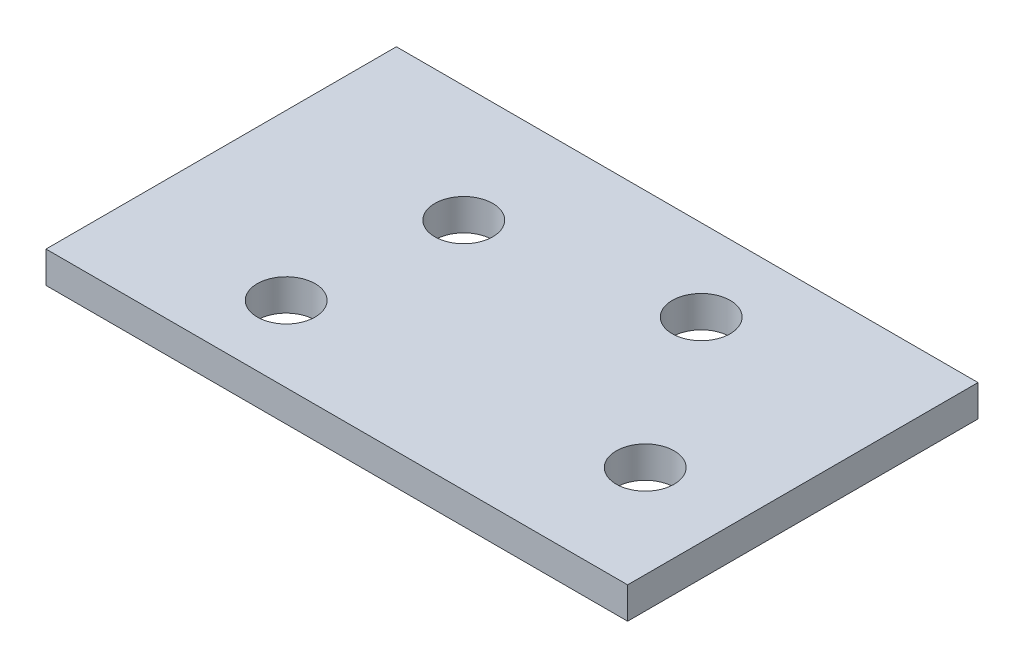
ISO-10303-21;
HEADER;
FILE_DESCRIPTION(('STEP AP214'),'2;1');
FILE_NAME('part.step','',(''),(''),'','','');
FILE_SCHEMA(('AUTOMOTIVE_DESIGN { 1 0 10303 214 1 1 1 1 }'));
ENDSEC;
DATA;
#1=APPLICATION_CONTEXT('core data for automotive mechanical design processes');
#2=APPLICATION_PROTOCOL_DEFINITION('international standard','automotive_design',2000,#1);
#3=PRODUCT_CONTEXT('',#1,'mechanical');
#4=PRODUCT('Part','Part','',(#3));
#5=PRODUCT_RELATED_PRODUCT_CATEGORY('part','',(#4));
#6=PRODUCT_DEFINITION_FORMATION('','',#4);
#7=PRODUCT_DEFINITION_CONTEXT('part definition',#1,'design');
#8=PRODUCT_DEFINITION('design','',#6,#7);
#9=PRODUCT_DEFINITION_SHAPE('','',#8);
#10=(LENGTH_UNIT() NAMED_UNIT(*) SI_UNIT(.MILLI.,.METRE.));
#11=(NAMED_UNIT(*) PLANE_ANGLE_UNIT() SI_UNIT($,.RADIAN.));
#12=(NAMED_UNIT(*) SI_UNIT($,.STERADIAN.) SOLID_ANGLE_UNIT());
#13=UNCERTAINTY_MEASURE_WITH_UNIT(LENGTH_MEASURE(1.E-05),#10,'distance_accuracy_value','');
#14=(GEOMETRIC_REPRESENTATION_CONTEXT(3) GLOBAL_UNCERTAINTY_ASSIGNED_CONTEXT((#13)) GLOBAL_UNIT_ASSIGNED_CONTEXT((#10,
#11,#12)) REPRESENTATION_CONTEXT('',''));
#15=CARTESIAN_POINT('',(0.,0.,0.));
#16=DIRECTION('',(0.,0.,1.));
#17=DIRECTION('',(1.,0.,0.));
#18=AXIS2_PLACEMENT_3D('',#15,#16,#17);
#19=CARTESIAN_POINT('',(6.33000000000002,14.,-4.95));
#20=DIRECTION('',(0.,-1.,0.));
#21=DIRECTION('',(0.,0.,-1.));
#22=AXIS2_PLACEMENT_3D('',#19,#20,#21);
#23=CYLINDRICAL_SURFACE('',#22,1.5);
#24=CARTESIAN_POINT('',(6.33000000000002,12.3661335932042,-4.95));
#25=DIRECTION('',(0.,1.,0.));
#26=DIRECTION('',(0.,0.,1.));
#27=AXIS2_PLACEMENT_3D('',#24,#25,#26);
#28=CIRCLE('',#27,1.5);
#29=CARTESIAN_POINT('',(6.33000000000002,12.3661335932042,-6.45));
#30=VERTEX_POINT('',#29);
#31=EDGE_CURVE('E138',#30,#30,#28,.F.);
#32=CARTESIAN_POINT('',(6.33000000000002,14.,-4.95));
#33=DIRECTION('',(0.,-1.,0.));
#34=DIRECTION('',(0.,0.,-1.));
#35=AXIS2_PLACEMENT_3D('',#32,#33,#34);
#36=CIRCLE('',#35,1.5);
#37=CARTESIAN_POINT('',(6.33000000000002,14.,-6.45));
#38=VERTEX_POINT('',#37);
#39=EDGE_CURVE('E142',#38,#38,#36,.T.);
#40=CARTESIAN_POINT('',(6.33000000000002,12.3661335932042,-6.45));
#41=CARTESIAN_POINT('',(6.33000000000002,12.3831530349416,-6.45));
#42=CARTESIAN_POINT('',(6.33000000000002,12.4001724766791,-6.45));
#43=CARTESIAN_POINT('',(6.33000000000002,12.434211360154,-6.45));
#44=CARTESIAN_POINT('',(6.33000000000002,12.4512308018914,-6.45));
#45=CARTESIAN_POINT('',(6.33000000000002,12.4852696853664,-6.45));
#46=CARTESIAN_POINT('',(6.33000000000002,12.5022891271038,-6.45));
#47=CARTESIAN_POINT('',(6.33000000000002,12.5363280105787,-6.45));
#48=CARTESIAN_POINT('',(6.33000000000002,12.5533474523162,-6.45));
#49=CARTESIAN_POINT('',(6.33000000000002,12.5873863357911,-6.45));
#50=CARTESIAN_POINT('',(6.33000000000002,12.6044057775285,-6.45));
#51=CARTESIAN_POINT('',(6.33000000000002,12.6384446610035,-6.45));
#52=CARTESIAN_POINT('',(6.33000000000002,12.6554641027409,-6.45));
#53=CARTESIAN_POINT('',(6.33000000000002,12.6895029862158,-6.45));
#54=CARTESIAN_POINT('',(6.33000000000002,12.7065224279533,-6.45));
#55=CARTESIAN_POINT('',(6.33000000000002,12.7405613114282,-6.45));
#56=CARTESIAN_POINT('',(6.33000000000002,12.7575807531657,-6.45));
#57=CARTESIAN_POINT('',(6.33000000000002,12.7916196366406,-6.45));
#58=CARTESIAN_POINT('',(6.33000000000002,12.808639078378,-6.45));
#59=CARTESIAN_POINT('',(6.33000000000002,12.8426779618529,-6.45));
#60=CARTESIAN_POINT('',(6.33000000000002,12.8596974035904,-6.45));
#61=CARTESIAN_POINT('',(6.33000000000002,12.8937362870653,-6.45));
#62=CARTESIAN_POINT('',(6.33000000000002,12.9107557288028,-6.45));
#63=CARTESIAN_POINT('',(6.33000000000002,12.9447946122777,-6.45));
#64=CARTESIAN_POINT('',(6.33000000000002,12.9618140540151,-6.45));
#65=CARTESIAN_POINT('',(6.33000000000002,12.9958529374901,-6.45));
#66=CARTESIAN_POINT('',(6.33000000000002,13.0128723792275,-6.45));
#67=CARTESIAN_POINT('',(6.33000000000002,13.0469112627024,-6.45));
#68=CARTESIAN_POINT('',(6.33000000000002,13.0639307044399,-6.45));
#69=CARTESIAN_POINT('',(6.33000000000002,13.0979695879148,-6.45));
#70=CARTESIAN_POINT('',(6.33000000000002,13.1149890296522,-6.45));
#71=CARTESIAN_POINT('',(6.33000000000002,13.1490279131272,-6.45));
#72=CARTESIAN_POINT('',(6.33000000000002,13.1660473548646,-6.45));
#73=CARTESIAN_POINT('',(6.33000000000002,13.2000862383395,-6.45));
#74=CARTESIAN_POINT('',(6.33000000000002,13.217105680077,-6.45));
#75=CARTESIAN_POINT('',(6.33000000000002,13.2511445635519,-6.45));
#76=CARTESIAN_POINT('',(6.33000000000002,13.2681640052894,-6.45));
#77=CARTESIAN_POINT('',(6.33000000000002,13.3022028887643,-6.45));
#78=CARTESIAN_POINT('',(6.33000000000002,13.3192223305017,-6.45));
#79=CARTESIAN_POINT('',(6.33000000000002,13.3532612139766,-6.45));
#80=CARTESIAN_POINT('',(6.33000000000002,13.3702806557141,-6.45));
#81=CARTESIAN_POINT('',(6.33000000000002,13.404319539189,-6.45));
#82=CARTESIAN_POINT('',(6.33000000000002,13.4213389809265,-6.45));
#83=CARTESIAN_POINT('',(6.33000000000002,13.4553778644014,-6.45));
#84=CARTESIAN_POINT('',(6.33000000000002,13.4723973061388,-6.45));
#85=CARTESIAN_POINT('',(6.33000000000002,13.5064361896138,-6.45));
#86=CARTESIAN_POINT('',(6.33000000000002,13.5234556313512,-6.45));
#87=CARTESIAN_POINT('',(6.33000000000002,13.5574945148261,-6.45));
#88=CARTESIAN_POINT('',(6.33000000000002,13.5745139565636,-6.45));
#89=CARTESIAN_POINT('',(6.33000000000002,13.6085528400385,-6.45));
#90=CARTESIAN_POINT('',(6.33000000000002,13.625572281776,-6.45));
#91=CARTESIAN_POINT('',(6.33000000000002,13.6596111652509,-6.45));
#92=CARTESIAN_POINT('',(6.33000000000002,13.6766306069883,-6.45));
#93=CARTESIAN_POINT('',(6.33000000000002,13.7106694904632,-6.45));
#94=CARTESIAN_POINT('',(6.33000000000002,13.7276889322007,-6.45));
#95=CARTESIAN_POINT('',(6.33000000000002,13.7617278156756,-6.45));
#96=CARTESIAN_POINT('',(6.33000000000002,13.7787472574131,-6.45));
#97=CARTESIAN_POINT('',(6.33000000000002,13.812786140888,-6.45));
#98=CARTESIAN_POINT('',(6.33000000000002,13.8298055826254,-6.45));
#99=CARTESIAN_POINT('',(6.33000000000002,13.8638444661003,-6.45));
#100=CARTESIAN_POINT('',(6.33000000000002,13.8808639078378,-6.45));
#101=CARTESIAN_POINT('',(6.33000000000002,13.9149027913127,-6.45));
#102=CARTESIAN_POINT('',(6.33000000000002,13.9319222330502,-6.45));
#103=CARTESIAN_POINT('',(6.33000000000002,13.9659611165251,-6.45));
#104=CARTESIAN_POINT('',(6.33000000000002,13.9829805582625,-6.45));
#105=CARTESIAN_POINT('',(6.33000000000002,14.,-6.45));
#106=B_SPLINE_CURVE_WITH_KNOTS('',3,(#40,#41,#42,#43,#44,#45,#46,#47,#48,#49,#50,#51,#52,#53,
#54,#55,#56,#57,#58,#59,#60,#61,#62,#63,#64,#65,#66,#67,#68,#69,#70,#71,#72,#73,#74,#75,#76,#77,
#78,#79,#80,#81,#82,#83,#84,#85,#86,#87,#88,#89,#90,#91,#92,#93,#94,#95,#96,#97,#98,#99,#100,
#101,#102,#103,#104,#105),.UNSPECIFIED.,.F.,.F.,(4,2,2,2,2,2,2,2,2,2,2,2,2,2,2,2,2,2,2,2,2,2,2,
2,2,2,2,2,2,2,2,2,4),(0.,0.0510583252123706,0.102116650424741,0.153174975637112,
0.204233300849481,0.255291626061851,0.306349951274222,0.357408276486592,0.408466601698963,
0.459524926911334,0.510583252123702,0.561641577336073,0.612699902548444,0.663758227760814,
0.714816552973183,0.765874878185554,0.816933203397924,0.867991528610295,0.919049853822665,
0.970108179035034,1.0211665042474,1.07222482945978,1.12328315467215,1.17434147988451,
1.22539980509689,1.27645813030926,1.32751645552163,1.378574780734,1.42963310594637,
1.48069143115874,1.53174975637111,1.58280808158348,1.63386640679585),.UNSPECIFIED.);
#107=EDGE_CURVE('BSEAM45',#30,#38,#106,.T.);
#108=ORIENTED_EDGE('',*,*,#31,.T.);
#109=ORIENTED_EDGE('',*,*,#39,.F.);
#110=ORIENTED_EDGE('',*,*,#107,.T.);
#111=ORIENTED_EDGE('',*,*,#107,.F.);
#112=EDGE_LOOP('',(#108,#110,#109,#111));
#113=FACE_BOUND('',#112,.T.);
#114=ADVANCED_FACE('F45',(#113),#23,.F.);
#115=CARTESIAN_POINT('',(-4.16999999999998,14.,-3.14999999999999));
#116=DIRECTION('',(0.,-1.,0.));
#117=DIRECTION('',(0.,0.,-1.));
#118=AXIS2_PLACEMENT_3D('',#115,#116,#117);
#119=CYLINDRICAL_SURFACE('',#118,1.5);
#120=CARTESIAN_POINT('',(-4.16999999999998,12.3661335932042,-3.14999999999999));
#121=DIRECTION('',(0.,1.,0.));
#122=DIRECTION('',(0.,0.,1.));
#123=AXIS2_PLACEMENT_3D('',#120,#121,#122);
#124=CIRCLE('',#123,1.5);
#125=CARTESIAN_POINT('',(-4.16999999999998,12.3661335932042,-4.64999999999999));
#126=VERTEX_POINT('',#125);
#127=EDGE_CURVE('E134',#126,#126,#124,.F.);
#128=CARTESIAN_POINT('',(-4.16999999999998,14.,-3.14999999999999));
#129=DIRECTION('',(0.,-1.,0.));
#130=DIRECTION('',(0.,0.,-1.));
#131=AXIS2_PLACEMENT_3D('',#128,#129,#130);
#132=CIRCLE('',#131,1.5);
#133=CARTESIAN_POINT('',(-4.16999999999998,14.,-4.64999999999999));
#134=VERTEX_POINT('',#133);
#135=EDGE_CURVE('E151',#134,#134,#132,.T.);
#136=CARTESIAN_POINT('',(-4.16999999999998,12.3661335932042,-4.64999999999999));
#137=CARTESIAN_POINT('',(-4.16999999999998,12.3831530349416,-4.64999999999999));
#138=CARTESIAN_POINT('',(-4.16999999999998,12.4001724766791,-4.64999999999999));
#139=CARTESIAN_POINT('',(-4.16999999999998,12.434211360154,-4.64999999999999));
#140=CARTESIAN_POINT('',(-4.16999999999998,12.4512308018914,-4.64999999999999));
#141=CARTESIAN_POINT('',(-4.16999999999998,12.4852696853664,-4.64999999999999));
#142=CARTESIAN_POINT('',(-4.16999999999998,12.5022891271038,-4.64999999999999));
#143=CARTESIAN_POINT('',(-4.16999999999998,12.5363280105787,-4.64999999999999));
#144=CARTESIAN_POINT('',(-4.16999999999998,12.5533474523162,-4.64999999999999));
#145=CARTESIAN_POINT('',(-4.16999999999998,12.5873863357911,-4.64999999999999));
#146=CARTESIAN_POINT('',(-4.16999999999998,12.6044057775285,-4.64999999999999));
#147=CARTESIAN_POINT('',(-4.16999999999998,12.6384446610035,-4.64999999999999));
#148=CARTESIAN_POINT('',(-4.16999999999998,12.6554641027409,-4.64999999999999));
#149=CARTESIAN_POINT('',(-4.16999999999998,12.6895029862158,-4.64999999999999));
#150=CARTESIAN_POINT('',(-4.16999999999998,12.7065224279533,-4.64999999999999));
#151=CARTESIAN_POINT('',(-4.16999999999998,12.7405613114282,-4.64999999999999));
#152=CARTESIAN_POINT('',(-4.16999999999998,12.7575807531657,-4.64999999999999));
#153=CARTESIAN_POINT('',(-4.16999999999998,12.7916196366406,-4.64999999999999));
#154=CARTESIAN_POINT('',(-4.16999999999998,12.808639078378,-4.64999999999999));
#155=CARTESIAN_POINT('',(-4.16999999999998,12.8426779618529,-4.64999999999999));
#156=CARTESIAN_POINT('',(-4.16999999999998,12.8596974035904,-4.64999999999999));
#157=CARTESIAN_POINT('',(-4.16999999999998,12.8937362870653,-4.64999999999999));
#158=CARTESIAN_POINT('',(-4.16999999999998,12.9107557288028,-4.64999999999999));
#159=CARTESIAN_POINT('',(-4.16999999999998,12.9447946122777,-4.64999999999999));
#160=CARTESIAN_POINT('',(-4.16999999999998,12.9618140540151,-4.64999999999999));
#161=CARTESIAN_POINT('',(-4.16999999999998,12.9958529374901,-4.64999999999999));
#162=CARTESIAN_POINT('',(-4.16999999999998,13.0128723792275,-4.64999999999999));
#163=CARTESIAN_POINT('',(-4.16999999999998,13.0469112627024,-4.64999999999999));
#164=CARTESIAN_POINT('',(-4.16999999999998,13.0639307044399,-4.64999999999999));
#165=CARTESIAN_POINT('',(-4.16999999999998,13.0979695879148,-4.64999999999999));
#166=CARTESIAN_POINT('',(-4.16999999999998,13.1149890296522,-4.64999999999999));
#167=CARTESIAN_POINT('',(-4.16999999999998,13.1490279131272,-4.64999999999999));
#168=CARTESIAN_POINT('',(-4.16999999999998,13.1660473548646,-4.64999999999999));
#169=CARTESIAN_POINT('',(-4.16999999999998,13.2000862383395,-4.64999999999999));
#170=CARTESIAN_POINT('',(-4.16999999999998,13.217105680077,-4.64999999999999));
#171=CARTESIAN_POINT('',(-4.16999999999998,13.2511445635519,-4.64999999999999));
#172=CARTESIAN_POINT('',(-4.16999999999998,13.2681640052894,-4.64999999999999));
#173=CARTESIAN_POINT('',(-4.16999999999998,13.3022028887643,-4.64999999999999));
#174=CARTESIAN_POINT('',(-4.16999999999998,13.3192223305017,-4.64999999999999));
#175=CARTESIAN_POINT('',(-4.16999999999998,13.3532612139766,-4.64999999999999));
#176=CARTESIAN_POINT('',(-4.16999999999998,13.3702806557141,-4.64999999999999));
#177=CARTESIAN_POINT('',(-4.16999999999998,13.404319539189,-4.64999999999999));
#178=CARTESIAN_POINT('',(-4.16999999999998,13.4213389809265,-4.64999999999999));
#179=CARTESIAN_POINT('',(-4.16999999999998,13.4553778644014,-4.64999999999999));
#180=CARTESIAN_POINT('',(-4.16999999999998,13.4723973061388,-4.64999999999999));
#181=CARTESIAN_POINT('',(-4.16999999999998,13.5064361896138,-4.64999999999999));
#182=CARTESIAN_POINT('',(-4.16999999999998,13.5234556313512,-4.64999999999999));
#183=CARTESIAN_POINT('',(-4.16999999999998,13.5574945148261,-4.64999999999999));
#184=CARTESIAN_POINT('',(-4.16999999999998,13.5745139565636,-4.64999999999999));
#185=CARTESIAN_POINT('',(-4.16999999999998,13.6085528400385,-4.64999999999999));
#186=CARTESIAN_POINT('',(-4.16999999999998,13.625572281776,-4.64999999999999));
#187=CARTESIAN_POINT('',(-4.16999999999998,13.6596111652509,-4.64999999999999));
#188=CARTESIAN_POINT('',(-4.16999999999998,13.6766306069883,-4.64999999999999));
#189=CARTESIAN_POINT('',(-4.16999999999998,13.7106694904632,-4.64999999999999));
#190=CARTESIAN_POINT('',(-4.16999999999998,13.7276889322007,-4.64999999999999));
#191=CARTESIAN_POINT('',(-4.16999999999998,13.7617278156756,-4.64999999999999));
#192=CARTESIAN_POINT('',(-4.16999999999998,13.7787472574131,-4.64999999999999));
#193=CARTESIAN_POINT('',(-4.16999999999998,13.812786140888,-4.64999999999999));
#194=CARTESIAN_POINT('',(-4.16999999999998,13.8298055826254,-4.64999999999999));
#195=CARTESIAN_POINT('',(-4.16999999999998,13.8638444661003,-4.64999999999999));
#196=CARTESIAN_POINT('',(-4.16999999999998,13.8808639078378,-4.64999999999999));
#197=CARTESIAN_POINT('',(-4.16999999999998,13.9149027913127,-4.64999999999999));
#198=CARTESIAN_POINT('',(-4.16999999999998,13.9319222330502,-4.64999999999999));
#199=CARTESIAN_POINT('',(-4.16999999999998,13.9659611165251,-4.64999999999999));
#200=CARTESIAN_POINT('',(-4.16999999999998,13.9829805582625,-4.64999999999999));
#201=CARTESIAN_POINT('',(-4.16999999999998,14.,-4.64999999999999));
#202=B_SPLINE_CURVE_WITH_KNOTS('',3,(#136,#137,#138,#139,#140,#141,#142,#143,#144,#145,#146,
#147,#148,#149,#150,#151,#152,#153,#154,#155,#156,#157,#158,#159,#160,#161,#162,#163,#164,#165,
#166,#167,#168,#169,#170,#171,#172,#173,#174,#175,#176,#177,#178,#179,#180,#181,#182,#183,#184,
#185,#186,#187,#188,#189,#190,#191,#192,#193,#194,#195,#196,#197,#198,#199,#200,#201),
.UNSPECIFIED.,.F.,.F.,(4,2,2,2,2,2,2,2,2,2,2,2,2,2,2,2,2,2,2,2,2,2,2,2,2,2,2,2,2,2,2,2,4),(0.,
0.0510583252123706,0.102116650424741,0.153174975637112,0.204233300849481,0.255291626061851,
0.306349951274222,0.357408276486592,0.408466601698963,0.459524926911334,0.510583252123702,
0.561641577336073,0.612699902548444,0.663758227760814,0.714816552973183,0.765874878185554,
0.816933203397924,0.867991528610295,0.919049853822665,0.970108179035034,1.0211665042474,
1.07222482945978,1.12328315467215,1.17434147988451,1.22539980509689,1.27645813030926,
1.32751645552163,1.378574780734,1.42963310594637,1.48069143115874,1.53174975637111,
1.58280808158348,1.63386640679585),.UNSPECIFIED.);
#203=EDGE_CURVE('BSEAM179',#126,#134,#202,.T.);
#204=ORIENTED_EDGE('',*,*,#127,.T.);
#205=ORIENTED_EDGE('',*,*,#135,.F.);
#206=ORIENTED_EDGE('',*,*,#203,.T.);
#207=ORIENTED_EDGE('',*,*,#203,.F.);
#208=EDGE_LOOP('',(#204,#206,#205,#207));
#209=FACE_BOUND('',#208,.T.);
#210=ADVANCED_FACE('F179',(#209),#119,.F.);
#211=CARTESIAN_POINT('',(-5.17,14.,5.05000000000001));
#212=DIRECTION('',(0.,-1.,0.));
#213=DIRECTION('',(0.,0.,-1.));
#214=AXIS2_PLACEMENT_3D('',#211,#212,#213);
#215=CYLINDRICAL_SURFACE('',#214,1.5);
#216=CARTESIAN_POINT('',(-5.17,12.3661335932042,5.05000000000001));
#217=DIRECTION('',(0.,1.,0.));
#218=DIRECTION('',(0.,0.,1.));
#219=AXIS2_PLACEMENT_3D('',#216,#217,#218);
#220=CIRCLE('',#219,1.5);
#221=CARTESIAN_POINT('',(-5.17,12.3661335932042,3.55000000000001));
#222=VERTEX_POINT('',#221);
#223=EDGE_CURVE('E127',#222,#222,#220,.F.);
#224=CARTESIAN_POINT('',(-5.17,14.,5.05000000000001));
#225=DIRECTION('',(0.,-1.,0.));
#226=DIRECTION('',(0.,0.,-1.));
#227=AXIS2_PLACEMENT_3D('',#224,#225,#226);
#228=CIRCLE('',#227,1.5);
#229=CARTESIAN_POINT('',(-5.17,14.,3.55000000000001));
#230=VERTEX_POINT('',#229);
#231=EDGE_CURVE('E147',#230,#230,#228,.T.);
#232=CARTESIAN_POINT('',(-5.17,12.3661335932042,3.55000000000001));
#233=CARTESIAN_POINT('',(-5.17,12.3831530349416,3.55000000000001));
#234=CARTESIAN_POINT('',(-5.17,12.4001724766791,3.55000000000001));
#235=CARTESIAN_POINT('',(-5.17,12.434211360154,3.55000000000001));
#236=CARTESIAN_POINT('',(-5.17,12.4512308018914,3.55000000000001));
#237=CARTESIAN_POINT('',(-5.17,12.4852696853664,3.55000000000001));
#238=CARTESIAN_POINT('',(-5.17,12.5022891271038,3.55000000000001));
#239=CARTESIAN_POINT('',(-5.17,12.5363280105787,3.55000000000001));
#240=CARTESIAN_POINT('',(-5.17,12.5533474523162,3.55000000000001));
#241=CARTESIAN_POINT('',(-5.17,12.5873863357911,3.55000000000001));
#242=CARTESIAN_POINT('',(-5.17,12.6044057775285,3.55000000000001));
#243=CARTESIAN_POINT('',(-5.17,12.6384446610035,3.55000000000001));
#244=CARTESIAN_POINT('',(-5.17,12.6554641027409,3.55000000000001));
#245=CARTESIAN_POINT('',(-5.17,12.6895029862158,3.55000000000001));
#246=CARTESIAN_POINT('',(-5.17,12.7065224279533,3.55000000000001));
#247=CARTESIAN_POINT('',(-5.17,12.7405613114282,3.55000000000001));
#248=CARTESIAN_POINT('',(-5.17,12.7575807531657,3.55000000000001));
#249=CARTESIAN_POINT('',(-5.17,12.7916196366406,3.55000000000001));
#250=CARTESIAN_POINT('',(-5.17,12.808639078378,3.55000000000001));
#251=CARTESIAN_POINT('',(-5.17,12.8426779618529,3.55000000000001));
#252=CARTESIAN_POINT('',(-5.17,12.8596974035904,3.55000000000001));
#253=CARTESIAN_POINT('',(-5.17,12.8937362870653,3.55000000000001));
#254=CARTESIAN_POINT('',(-5.17,12.9107557288028,3.55000000000001));
#255=CARTESIAN_POINT('',(-5.17,12.9447946122777,3.55000000000001));
#256=CARTESIAN_POINT('',(-5.17,12.9618140540151,3.55000000000001));
#257=CARTESIAN_POINT('',(-5.17,12.9958529374901,3.55000000000001));
#258=CARTESIAN_POINT('',(-5.17,13.0128723792275,3.55000000000001));
#259=CARTESIAN_POINT('',(-5.17,13.0469112627024,3.55000000000001));
#260=CARTESIAN_POINT('',(-5.17,13.0639307044399,3.55000000000001));
#261=CARTESIAN_POINT('',(-5.17,13.0979695879148,3.55000000000001));
#262=CARTESIAN_POINT('',(-5.17,13.1149890296522,3.55000000000001));
#263=CARTESIAN_POINT('',(-5.17,13.1490279131272,3.55000000000001));
#264=CARTESIAN_POINT('',(-5.17,13.1660473548646,3.55000000000001));
#265=CARTESIAN_POINT('',(-5.17,13.2000862383395,3.55000000000001));
#266=CARTESIAN_POINT('',(-5.17,13.217105680077,3.55000000000001));
#267=CARTESIAN_POINT('',(-5.17,13.2511445635519,3.55000000000001));
#268=CARTESIAN_POINT('',(-5.17,13.2681640052894,3.55000000000001));
#269=CARTESIAN_POINT('',(-5.17,13.3022028887643,3.55000000000001));
#270=CARTESIAN_POINT('',(-5.17,13.3192223305017,3.55000000000001));
#271=CARTESIAN_POINT('',(-5.17,13.3532612139766,3.55000000000001));
#272=CARTESIAN_POINT('',(-5.17,13.3702806557141,3.55000000000001));
#273=CARTESIAN_POINT('',(-5.17,13.404319539189,3.55000000000001));
#274=CARTESIAN_POINT('',(-5.17,13.4213389809265,3.55000000000001));
#275=CARTESIAN_POINT('',(-5.17,13.4553778644014,3.55000000000001));
#276=CARTESIAN_POINT('',(-5.17,13.4723973061388,3.55000000000001));
#277=CARTESIAN_POINT('',(-5.17,13.5064361896138,3.55000000000001));
#278=CARTESIAN_POINT('',(-5.17,13.5234556313512,3.55000000000001));
#279=CARTESIAN_POINT('',(-5.17,13.5574945148261,3.55000000000001));
#280=CARTESIAN_POINT('',(-5.17,13.5745139565636,3.55000000000001));
#281=CARTESIAN_POINT('',(-5.17,13.6085528400385,3.55000000000001));
#282=CARTESIAN_POINT('',(-5.17,13.625572281776,3.55000000000001));
#283=CARTESIAN_POINT('',(-5.17,13.6596111652509,3.55000000000001));
#284=CARTESIAN_POINT('',(-5.17,13.6766306069883,3.55000000000001));
#285=CARTESIAN_POINT('',(-5.17,13.7106694904632,3.55000000000001));
#286=CARTESIAN_POINT('',(-5.17,13.7276889322007,3.55000000000001));
#287=CARTESIAN_POINT('',(-5.17,13.7617278156756,3.55000000000001));
#288=CARTESIAN_POINT('',(-5.17,13.7787472574131,3.55000000000001));
#289=CARTESIAN_POINT('',(-5.17,13.812786140888,3.55000000000001));
#290=CARTESIAN_POINT('',(-5.17,13.8298055826254,3.55000000000001));
#291=CARTESIAN_POINT('',(-5.17,13.8638444661003,3.55000000000001));
#292=CARTESIAN_POINT('',(-5.17,13.8808639078378,3.55000000000001));
#293=CARTESIAN_POINT('',(-5.17,13.9149027913127,3.55000000000001));
#294=CARTESIAN_POINT('',(-5.17,13.9319222330502,3.55000000000001));
#295=CARTESIAN_POINT('',(-5.17,13.9659611165251,3.55000000000001));
#296=CARTESIAN_POINT('',(-5.17,13.9829805582625,3.55000000000001));
#297=CARTESIAN_POINT('',(-5.17,14.,3.55000000000001));
#298=B_SPLINE_CURVE_WITH_KNOTS('',3,(#232,#233,#234,#235,#236,#237,#238,#239,#240,#241,#242,
#243,#244,#245,#246,#247,#248,#249,#250,#251,#252,#253,#254,#255,#256,#257,#258,#259,#260,#261,
#262,#263,#264,#265,#266,#267,#268,#269,#270,#271,#272,#273,#274,#275,#276,#277,#278,#279,#280,
#281,#282,#283,#284,#285,#286,#287,#288,#289,#290,#291,#292,#293,#294,#295,#296,#297),
.UNSPECIFIED.,.F.,.F.,(4,2,2,2,2,2,2,2,2,2,2,2,2,2,2,2,2,2,2,2,2,2,2,2,2,2,2,2,2,2,2,2,4),(0.,
0.0510583252123706,0.102116650424741,0.153174975637112,0.204233300849481,0.255291626061851,
0.306349951274222,0.357408276486592,0.408466601698963,0.459524926911334,0.510583252123702,
0.561641577336073,0.612699902548444,0.663758227760814,0.714816552973183,0.765874878185554,
0.816933203397924,0.867991528610295,0.919049853822665,0.970108179035034,1.0211665042474,
1.07222482945978,1.12328315467215,1.17434147988451,1.22539980509689,1.27645813030926,
1.32751645552163,1.378574780734,1.42963310594637,1.48069143115874,1.53174975637111,
1.58280808158348,1.63386640679585),.UNSPECIFIED.);
#299=EDGE_CURVE('BSEAM184',#222,#230,#298,.T.);
#300=ORIENTED_EDGE('',*,*,#223,.T.);
#301=ORIENTED_EDGE('',*,*,#231,.F.);
#302=ORIENTED_EDGE('',*,*,#299,.T.);
#303=ORIENTED_EDGE('',*,*,#299,.F.);
#304=EDGE_LOOP('',(#300,#302,#301,#303));
#305=FACE_BOUND('',#304,.T.);
#306=ADVANCED_FACE('F184',(#305),#215,.F.);
#307=CARTESIAN_POINT('',(11.63,14.,3.25));
#308=DIRECTION('',(0.,-1.,0.));
#309=DIRECTION('',(0.,0.,-1.));
#310=AXIS2_PLACEMENT_3D('',#307,#308,#309);
#311=CYLINDRICAL_SURFACE('',#310,1.5);
#312=CARTESIAN_POINT('',(11.63,12.3661335932042,3.25));
#313=DIRECTION('',(0.,1.,0.));
#314=DIRECTION('',(0.,0.,1.));
#315=AXIS2_PLACEMENT_3D('',#312,#313,#314);
#316=CIRCLE('',#315,1.5);
#317=CARTESIAN_POINT('',(11.63,12.3661335932042,1.75));
#318=VERTEX_POINT('',#317);
#319=EDGE_CURVE('E122',#318,#318,#316,.F.);
#320=CARTESIAN_POINT('',(11.63,14.,3.25));
#321=DIRECTION('',(0.,-1.,0.));
#322=DIRECTION('',(0.,0.,-1.));
#323=AXIS2_PLACEMENT_3D('',#320,#321,#322);
#324=CIRCLE('',#323,1.5);
#325=CARTESIAN_POINT('',(11.63,14.,1.75));
#326=VERTEX_POINT('',#325);
#327=EDGE_CURVE('E143',#326,#326,#324,.T.);
#328=CARTESIAN_POINT('',(11.63,12.3661335932042,1.75));
#329=CARTESIAN_POINT('',(11.63,12.3831530349416,1.75));
#330=CARTESIAN_POINT('',(11.63,12.4001724766791,1.75));
#331=CARTESIAN_POINT('',(11.63,12.434211360154,1.75));
#332=CARTESIAN_POINT('',(11.63,12.4512308018914,1.75));
#333=CARTESIAN_POINT('',(11.63,12.4852696853664,1.75));
#334=CARTESIAN_POINT('',(11.63,12.5022891271038,1.75));
#335=CARTESIAN_POINT('',(11.63,12.5363280105787,1.75));
#336=CARTESIAN_POINT('',(11.63,12.5533474523162,1.75));
#337=CARTESIAN_POINT('',(11.63,12.5873863357911,1.75));
#338=CARTESIAN_POINT('',(11.63,12.6044057775285,1.75));
#339=CARTESIAN_POINT('',(11.63,12.6384446610035,1.75));
#340=CARTESIAN_POINT('',(11.63,12.6554641027409,1.75));
#341=CARTESIAN_POINT('',(11.63,12.6895029862158,1.75));
#342=CARTESIAN_POINT('',(11.63,12.7065224279533,1.75));
#343=CARTESIAN_POINT('',(11.63,12.7405613114282,1.75));
#344=CARTESIAN_POINT('',(11.63,12.7575807531657,1.75));
#345=CARTESIAN_POINT('',(11.63,12.7916196366406,1.75));
#346=CARTESIAN_POINT('',(11.63,12.808639078378,1.75));
#347=CARTESIAN_POINT('',(11.63,12.8426779618529,1.75));
#348=CARTESIAN_POINT('',(11.63,12.8596974035904,1.75));
#349=CARTESIAN_POINT('',(11.63,12.8937362870653,1.75));
#350=CARTESIAN_POINT('',(11.63,12.9107557288028,1.75));
#351=CARTESIAN_POINT('',(11.63,12.9447946122777,1.75));
#352=CARTESIAN_POINT('',(11.63,12.9618140540151,1.75));
#353=CARTESIAN_POINT('',(11.63,12.9958529374901,1.75));
#354=CARTESIAN_POINT('',(11.63,13.0128723792275,1.75));
#355=CARTESIAN_POINT('',(11.63,13.0469112627024,1.75));
#356=CARTESIAN_POINT('',(11.63,13.0639307044399,1.75));
#357=CARTESIAN_POINT('',(11.63,13.0979695879148,1.75));
#358=CARTESIAN_POINT('',(11.63,13.1149890296522,1.75));
#359=CARTESIAN_POINT('',(11.63,13.1490279131272,1.75));
#360=CARTESIAN_POINT('',(11.63,13.1660473548646,1.75));
#361=CARTESIAN_POINT('',(11.63,13.2000862383395,1.75));
#362=CARTESIAN_POINT('',(11.63,13.217105680077,1.75));
#363=CARTESIAN_POINT('',(11.63,13.2511445635519,1.75));
#364=CARTESIAN_POINT('',(11.63,13.2681640052894,1.75));
#365=CARTESIAN_POINT('',(11.63,13.3022028887643,1.75));
#366=CARTESIAN_POINT('',(11.63,13.3192223305017,1.75));
#367=CARTESIAN_POINT('',(11.63,13.3532612139766,1.75));
#368=CARTESIAN_POINT('',(11.63,13.3702806557141,1.75));
#369=CARTESIAN_POINT('',(11.63,13.404319539189,1.75));
#370=CARTESIAN_POINT('',(11.63,13.4213389809265,1.75));
#371=CARTESIAN_POINT('',(11.63,13.4553778644014,1.75));
#372=CARTESIAN_POINT('',(11.63,13.4723973061388,1.75));
#373=CARTESIAN_POINT('',(11.63,13.5064361896138,1.75));
#374=CARTESIAN_POINT('',(11.63,13.5234556313512,1.75));
#375=CARTESIAN_POINT('',(11.63,13.5574945148261,1.75));
#376=CARTESIAN_POINT('',(11.63,13.5745139565636,1.75));
#377=CARTESIAN_POINT('',(11.63,13.6085528400385,1.75));
#378=CARTESIAN_POINT('',(11.63,13.625572281776,1.75));
#379=CARTESIAN_POINT('',(11.63,13.6596111652509,1.75));
#380=CARTESIAN_POINT('',(11.63,13.6766306069883,1.75));
#381=CARTESIAN_POINT('',(11.63,13.7106694904632,1.75));
#382=CARTESIAN_POINT('',(11.63,13.7276889322007,1.75));
#383=CARTESIAN_POINT('',(11.63,13.7617278156756,1.75));
#384=CARTESIAN_POINT('',(11.63,13.7787472574131,1.75));
#385=CARTESIAN_POINT('',(11.63,13.812786140888,1.75));
#386=CARTESIAN_POINT('',(11.63,13.8298055826254,1.75));
#387=CARTESIAN_POINT('',(11.63,13.8638444661003,1.75));
#388=CARTESIAN_POINT('',(11.63,13.8808639078378,1.75));
#389=CARTESIAN_POINT('',(11.63,13.9149027913127,1.75));
#390=CARTESIAN_POINT('',(11.63,13.9319222330502,1.75));
#391=CARTESIAN_POINT('',(11.63,13.9659611165251,1.75));
#392=CARTESIAN_POINT('',(11.63,13.9829805582625,1.75));
#393=CARTESIAN_POINT('',(11.63,14.,1.75));
#394=B_SPLINE_CURVE_WITH_KNOTS('',3,(#328,#329,#330,#331,#332,#333,#334,#335,#336,#337,#338,
#339,#340,#341,#342,#343,#344,#345,#346,#347,#348,#349,#350,#351,#352,#353,#354,#355,#356,#357,
#358,#359,#360,#361,#362,#363,#364,#365,#366,#367,#368,#369,#370,#371,#372,#373,#374,#375,#376,
#377,#378,#379,#380,#381,#382,#383,#384,#385,#386,#387,#388,#389,#390,#391,#392,#393),
.UNSPECIFIED.,.F.,.F.,(4,2,2,2,2,2,2,2,2,2,2,2,2,2,2,2,2,2,2,2,2,2,2,2,2,2,2,2,2,2,2,2,4),(0.,
0.0510583252123706,0.102116650424741,0.153174975637112,0.204233300849481,0.255291626061851,
0.306349951274222,0.357408276486592,0.408466601698963,0.459524926911334,0.510583252123702,
0.561641577336073,0.612699902548444,0.663758227760814,0.714816552973183,0.765874878185554,
0.816933203397924,0.867991528610295,0.919049853822665,0.970108179035034,1.0211665042474,
1.07222482945978,1.12328315467215,1.17434147988451,1.22539980509689,1.27645813030926,
1.32751645552163,1.378574780734,1.42963310594637,1.48069143115874,1.53174975637111,
1.58280808158348,1.63386640679585),.UNSPECIFIED.);
#395=EDGE_CURVE('BSEAM191',#318,#326,#394,.T.);
#396=ORIENTED_EDGE('',*,*,#319,.T.);
#397=ORIENTED_EDGE('',*,*,#327,.F.);
#398=ORIENTED_EDGE('',*,*,#395,.T.);
#399=ORIENTED_EDGE('',*,*,#395,.F.);
#400=EDGE_LOOP('',(#396,#398,#397,#399));
#401=FACE_BOUND('',#400,.T.);
#402=ADVANCED_FACE('F191',(#401),#311,.F.);
#403=CARTESIAN_POINT('',(-13.6935756082828,14.,-9.18214889556079));
#404=DIRECTION('',(1.,0.,0.));
#405=DIRECTION('',(0.,0.,-1.));
#406=AXIS2_PLACEMENT_3D('',#403,#404,#405);
#407=PLANE('',#406);
#408=DIRECTION('',(0.,-1.,0.));
#409=VECTOR('',#408,1.);
#410=CARTESIAN_POINT('',(-13.6935756082828,14.,-9.18214889556079));
#411=LINE('',#410,#409);
#412=CARTESIAN_POINT('',(-13.6935756082828,14.,-9.18214889556079));
#413=VERTEX_POINT('',#412);
#414=CARTESIAN_POINT('',(-13.6935756082828,12.3661335932042,-9.18214889556079));
#415=VERTEX_POINT('',#414);
#416=EDGE_CURVE('E105',#413,#415,#411,.T.);
#417=ORIENTED_EDGE('',*,*,#416,.T.);
#418=DIRECTION('',(0.,0.,1.));
#419=VECTOR('',#418,1.);
#420=CARTESIAN_POINT('',(-13.6935756082828,12.3661335932042,-9.18214889556079));
#421=LINE('',#420,#419);
#422=CARTESIAN_POINT('',(-13.6935756082828,12.3661335932042,8.96905458068353));
#423=VERTEX_POINT('',#422);
#424=EDGE_CURVE('E61',#415,#423,#421,.T.);
#425=ORIENTED_EDGE('',*,*,#424,.T.);
#426=DIRECTION('',(0.,-1.,0.));
#427=VECTOR('',#426,1.);
#428=CARTESIAN_POINT('',(-13.6935756082828,14.,8.96905458068353));
#429=LINE('',#428,#427);
#430=CARTESIAN_POINT('',(-13.6935756082828,14.,8.96905458068353));
#431=VERTEX_POINT('',#430);
#432=EDGE_CURVE('E54',#431,#423,#429,.T.);
#433=ORIENTED_EDGE('',*,*,#432,.F.);
#434=DIRECTION('',(0.,0.,1.));
#435=VECTOR('',#434,1.);
#436=CARTESIAN_POINT('',(-13.6935756082828,14.,-9.18214889556079));
#437=LINE('',#436,#435);
#438=EDGE_CURVE('E120',#413,#431,#437,.T.);
#439=ORIENTED_EDGE('',*,*,#438,.F.);
#440=EDGE_LOOP('',(#417,#425,#433,#439));
#441=FACE_BOUND('',#440,.T.);
#442=ADVANCED_FACE('F47',(#441),#407,.F.);
#443=CARTESIAN_POINT('',(-13.6935756082828,14.,8.96905458068353));
#444=DIRECTION('',(0.,0.,-1.));
#445=DIRECTION('',(-1.,0.,0.));
#446=AXIS2_PLACEMENT_3D('',#443,#444,#445);
#447=PLANE('',#446);
#448=ORIENTED_EDGE('',*,*,#432,.T.);
#449=DIRECTION('',(1.,0.,0.));
#450=VECTOR('',#449,1.);
#451=CARTESIAN_POINT('',(-13.6935756082828,12.3661335932042,8.96905458068353));
#452=LINE('',#451,#450);
#453=CARTESIAN_POINT('',(16.4369304808005,12.3661335932042,8.96905458068353));
#454=VERTEX_POINT('',#453);
#455=EDGE_CURVE('E101',#423,#454,#452,.T.);
#456=ORIENTED_EDGE('',*,*,#455,.T.);
#457=DIRECTION('',(0.,-1.,0.));
#458=VECTOR('',#457,1.);
#459=CARTESIAN_POINT('',(16.4369304808005,14.,8.96905458068353));
#460=LINE('',#459,#458);
#461=CARTESIAN_POINT('',(16.4369304808005,14.,8.96905458068353));
#462=VERTEX_POINT('',#461);
#463=EDGE_CURVE('E99',#462,#454,#460,.T.);
#464=ORIENTED_EDGE('',*,*,#463,.F.);
#465=DIRECTION('',(1.,0.,0.));
#466=VECTOR('',#465,1.);
#467=CARTESIAN_POINT('',(-13.6935756082828,14.,8.96905458068353));
#468=LINE('',#467,#466);
#469=EDGE_CURVE('E117',#431,#462,#468,.T.);
#470=ORIENTED_EDGE('',*,*,#469,.F.);
#471=EDGE_LOOP('',(#448,#456,#464,#470));
#472=FACE_BOUND('',#471,.T.);
#473=ADVANCED_FACE('F116',(#472),#447,.F.);
#474=CARTESIAN_POINT('',(16.4369304808005,14.,-9.18214889556079));
#475=DIRECTION('',(-1.,0.,0.));
#476=DIRECTION('',(0.,0.,1.));
#477=AXIS2_PLACEMENT_3D('',#474,#475,#476);
#478=PLANE('',#477);
#479=ORIENTED_EDGE('',*,*,#463,.T.);
#480=DIRECTION('',(0.,0.,-1.));
#481=VECTOR('',#480,1.);
#482=CARTESIAN_POINT('',(16.4369304808005,12.3661335932042,-9.18214889556079));
#483=LINE('',#482,#481);
#484=CARTESIAN_POINT('',(16.4369304808005,12.3661335932042,-9.18214889556079));
#485=VERTEX_POINT('',#484);
#486=EDGE_CURVE('E87',#454,#485,#483,.T.);
#487=ORIENTED_EDGE('',*,*,#486,.T.);
#488=DIRECTION('',(0.,-1.,0.));
#489=VECTOR('',#488,1.);
#490=CARTESIAN_POINT('',(16.4369304808005,14.,-9.18214889556079));
#491=LINE('',#490,#489);
#492=CARTESIAN_POINT('',(16.4369304808005,14.,-9.18214889556079));
#493=VERTEX_POINT('',#492);
#494=EDGE_CURVE('E97',#493,#485,#491,.T.);
#495=ORIENTED_EDGE('',*,*,#494,.F.);
#496=DIRECTION('',(0.,0.,-1.));
#497=VECTOR('',#496,1.);
#498=CARTESIAN_POINT('',(16.4369304808005,14.,-9.18214889556079));
#499=LINE('',#498,#497);
#500=EDGE_CURVE('E162',#462,#493,#499,.T.);
#501=ORIENTED_EDGE('',*,*,#500,.F.);
#502=EDGE_LOOP('',(#479,#487,#495,#501));
#503=FACE_BOUND('',#502,.T.);
#504=ADVANCED_FACE('F95',(#503),#478,.F.);
#505=CARTESIAN_POINT('',(-13.6935756082828,14.,-9.18214889556079));
#506=DIRECTION('',(0.,0.,1.));
#507=DIRECTION('',(1.,0.,0.));
#508=AXIS2_PLACEMENT_3D('',#505,#506,#507);
#509=PLANE('',#508);
#510=ORIENTED_EDGE('',*,*,#494,.T.);
#511=DIRECTION('',(-1.,0.,0.));
#512=VECTOR('',#511,1.);
#513=CARTESIAN_POINT('',(-13.6935756082828,12.3661335932042,-9.18214889556079));
#514=LINE('',#513,#512);
#515=EDGE_CURVE('E11',#485,#415,#514,.T.);
#516=ORIENTED_EDGE('',*,*,#515,.T.);
#517=ORIENTED_EDGE('',*,*,#416,.F.);
#518=DIRECTION('',(-1.,0.,0.));
#519=VECTOR('',#518,1.);
#520=CARTESIAN_POINT('',(-13.6935756082828,14.,-9.18214889556079));
#521=LINE('',#520,#519);
#522=EDGE_CURVE('E68',#493,#413,#521,.T.);
#523=ORIENTED_EDGE('',*,*,#522,.F.);
#524=EDGE_LOOP('',(#510,#516,#517,#523));
#525=FACE_BOUND('',#524,.T.);
#526=ADVANCED_FACE('F103',(#525),#509,.F.);
#527=CARTESIAN_POINT('',(0.,14.,0.));
#528=DIRECTION('',(0.,1.,0.));
#529=DIRECTION('',(0.,0.,1.));
#530=AXIS2_PLACEMENT_3D('',#527,#528,#529);
#531=PLANE('',#530);
#532=ORIENTED_EDGE('',*,*,#327,.T.);
#533=EDGE_LOOP('',(#532));
#534=FACE_BOUND('',#533,.T.);
#535=ORIENTED_EDGE('',*,*,#231,.T.);
#536=EDGE_LOOP('',(#535));
#537=FACE_BOUND('',#536,.T.);
#538=ORIENTED_EDGE('',*,*,#135,.T.);
#539=EDGE_LOOP('',(#538));
#540=FACE_BOUND('',#539,.T.);
#541=ORIENTED_EDGE('',*,*,#39,.T.);
#542=EDGE_LOOP('',(#541));
#543=FACE_BOUND('',#542,.T.);
#544=ORIENTED_EDGE('',*,*,#438,.T.);
#545=ORIENTED_EDGE('',*,*,#469,.T.);
#546=ORIENTED_EDGE('',*,*,#500,.T.);
#547=ORIENTED_EDGE('',*,*,#522,.T.);
#548=EDGE_LOOP('',(#544,#545,#546,#547));
#549=FACE_BOUND('',#548,.T.);
#550=ADVANCED_FACE('F165',(#534,#537,#540,#543,#549),#531,.T.);
#551=CARTESIAN_POINT('',(-24.2894576617658,12.3661335932042,-27.5));
#552=DIRECTION('',(0.,1.,0.));
#553=DIRECTION('',(0.,0.,1.));
#554=AXIS2_PLACEMENT_3D('',#551,#552,#553);
#555=PLANE('',#554);
#556=ORIENTED_EDGE('',*,*,#127,.F.);
#557=EDGE_LOOP('',(#556));
#558=FACE_BOUND('',#557,.T.);
#559=ORIENTED_EDGE('',*,*,#319,.F.);
#560=EDGE_LOOP('',(#559));
#561=FACE_BOUND('',#560,.T.);
#562=ORIENTED_EDGE('',*,*,#515,.F.);
#563=ORIENTED_EDGE('',*,*,#486,.F.);
#564=ORIENTED_EDGE('',*,*,#455,.F.);
#565=ORIENTED_EDGE('',*,*,#424,.F.);
#566=EDGE_LOOP('',(#562,#563,#564,#565));
#567=FACE_BOUND('',#566,.T.);
#568=ORIENTED_EDGE('',*,*,#223,.F.);
#569=EDGE_LOOP('',(#568));
#570=FACE_BOUND('',#569,.T.);
#571=ORIENTED_EDGE('',*,*,#31,.F.);
#572=EDGE_LOOP('',(#571));
#573=FACE_BOUND('',#572,.T.);
#574=ADVANCED_FACE('F85',(#558,#561,#567,#570,#573),#555,.F.);
#575=CLOSED_SHELL('',(#114,#210,#306,#402,#442,#473,#504,#526,#550,#574));
#576=MANIFOLD_SOLID_BREP('B2',#575);
#577=ADVANCED_BREP_SHAPE_REPRESENTATION('',(#18,#576),#14);
#578=SHAPE_DEFINITION_REPRESENTATION(#9,#577);
ENDSEC;
END-ISO-10303-21;
